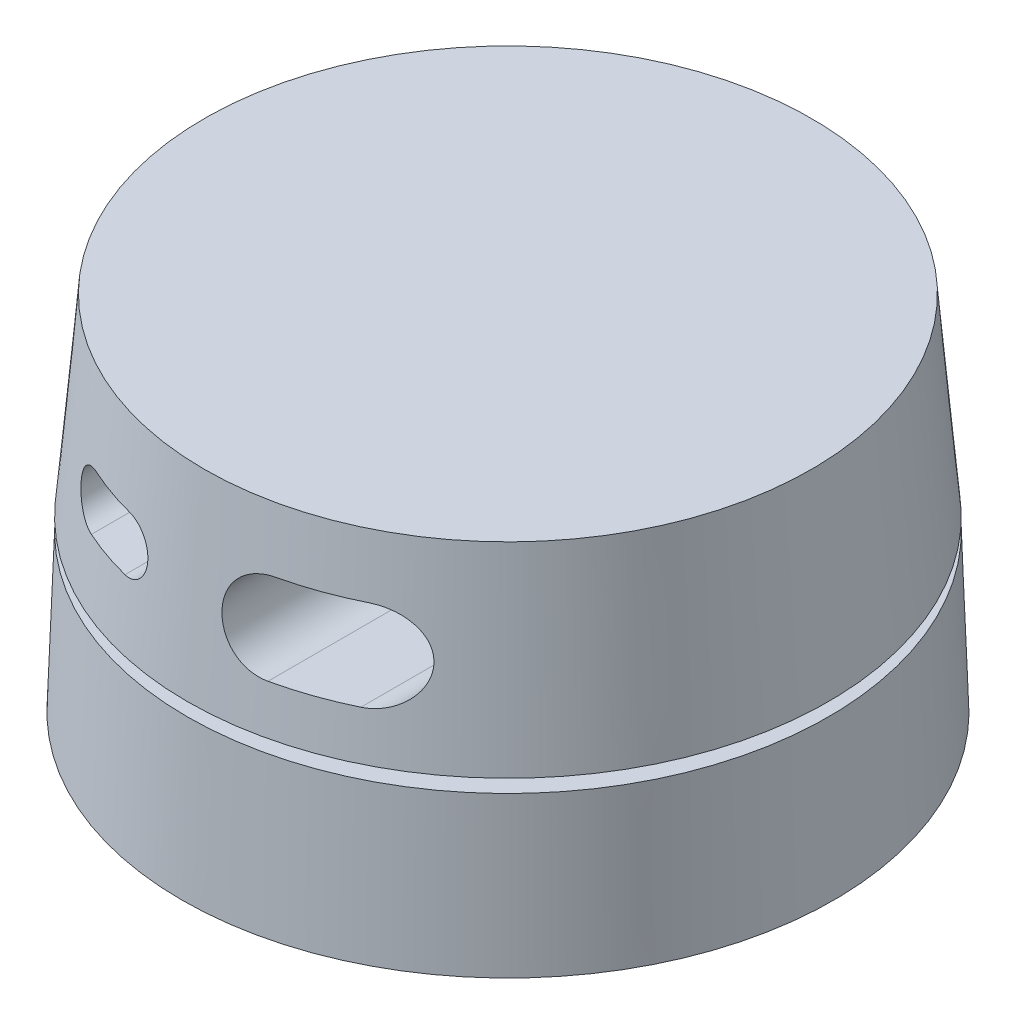
ISO-10303-21;
HEADER;
FILE_DESCRIPTION(('STEP AP214'),'2;1');
FILE_NAME('part.step','',(''),(''),'','','');
FILE_SCHEMA(('AUTOMOTIVE_DESIGN { 1 0 10303 214 1 1 1 1 }'));
ENDSEC;
DATA;
#1=APPLICATION_CONTEXT('core data for automotive mechanical design processes');
#2=APPLICATION_PROTOCOL_DEFINITION('international standard','automotive_design',2000,#1);
#3=PRODUCT_CONTEXT('',#1,'mechanical');
#4=PRODUCT('Part','Part','',(#3));
#5=PRODUCT_RELATED_PRODUCT_CATEGORY('part','',(#4));
#6=PRODUCT_DEFINITION_FORMATION('','',#4);
#7=PRODUCT_DEFINITION_CONTEXT('part definition',#1,'design');
#8=PRODUCT_DEFINITION('design','',#6,#7);
#9=PRODUCT_DEFINITION_SHAPE('','',#8);
#10=(LENGTH_UNIT() NAMED_UNIT(*) SI_UNIT(.MILLI.,.METRE.));
#11=(NAMED_UNIT(*) PLANE_ANGLE_UNIT() SI_UNIT($,.RADIAN.));
#12=(NAMED_UNIT(*) SI_UNIT($,.STERADIAN.) SOLID_ANGLE_UNIT());
#13=UNCERTAINTY_MEASURE_WITH_UNIT(LENGTH_MEASURE(1.E-05),#10,'distance_accuracy_value','');
#14=(GEOMETRIC_REPRESENTATION_CONTEXT(3) GLOBAL_UNCERTAINTY_ASSIGNED_CONTEXT((#13)) GLOBAL_UNIT_ASSIGNED_CONTEXT((#10,
#11,#12)) REPRESENTATION_CONTEXT('',''));
#15=CARTESIAN_POINT('',(0.,0.,0.));
#16=DIRECTION('',(0.,0.,1.));
#17=DIRECTION('',(1.,0.,0.));
#18=AXIS2_PLACEMENT_3D('',#15,#16,#17);
#19=CARTESIAN_POINT('',(0.,0.,0.));
#20=DIRECTION('',(0.,-1.,0.));
#21=DIRECTION('',(0.,0.,1.));
#22=AXIS2_PLACEMENT_3D('',#19,#20,#21);
#23=CONICAL_SURFACE('',#22,37.83,0.0349065850398867);
#24=CARTESIAN_POINT('',(0.,18.1,0.));
#25=DIRECTION('',(0.,1.,0.));
#26=DIRECTION('',(0.,0.,1.));
#27=AXIS2_PLACEMENT_3D('',#24,#25,#26);
#28=CIRCLE('',#27,37.1979340721994);
#29=CARTESIAN_POINT('',(0.,18.1,37.1979340721994));
#30=VERTEX_POINT('',#29);
#31=EDGE_CURVE('E191',#30,#30,#28,.T.);
#32=ORIENTED_EDGE('',*,*,#31,.F.);
#33=EDGE_LOOP('',(#32));
#34=FACE_BOUND('',#33,.T.);
#35=CARTESIAN_POINT('',(0.,0.,0.));
#36=DIRECTION('',(0.,1.,0.));
#37=DIRECTION('',(0.,0.,1.));
#38=AXIS2_PLACEMENT_3D('',#35,#36,#37);
#39=CIRCLE('',#38,37.83);
#40=CARTESIAN_POINT('',(0.,0.,37.83));
#41=VERTEX_POINT('',#40);
#42=EDGE_CURVE('E186',#41,#41,#39,.T.);
#43=ORIENTED_EDGE('',*,*,#42,.T.);
#44=EDGE_LOOP('',(#43));
#45=FACE_BOUND('',#44,.T.);
#46=ADVANCED_FACE('F33',(#34,#45),#23,.T.);
#47=CARTESIAN_POINT('',(0.,18.1,0.));
#48=DIRECTION('',(0.,1.,0.));
#49=DIRECTION('',(0.,0.,1.));
#50=AXIS2_PLACEMENT_3D('',#47,#48,#49);
#51=PLANE('',#50);
#52=CARTESIAN_POINT('',(0.,18.1,0.));
#53=DIRECTION('',(0.,1.,0.));
#54=DIRECTION('',(0.,0.,1.));
#55=AXIS2_PLACEMENT_3D('',#52,#53,#54);
#56=CIRCLE('',#55,34.);
#57=CARTESIAN_POINT('',(0.,18.1,34.));
#58=VERTEX_POINT('',#57);
#59=EDGE_CURVE('E187',#58,#58,#56,.T.);
#60=ORIENTED_EDGE('',*,*,#59,.F.);
#61=EDGE_LOOP('',(#60));
#62=FACE_BOUND('',#61,.T.);
#63=ORIENTED_EDGE('',*,*,#31,.T.);
#64=EDGE_LOOP('',(#63));
#65=FACE_BOUND('',#64,.T.);
#66=ADVANCED_FACE('F261',(#62,#65),#51,.T.);
#67=CARTESIAN_POINT('',(0.,0.,0.));
#68=DIRECTION('',(0.,1.,0.));
#69=DIRECTION('',(0.,0.,1.));
#70=AXIS2_PLACEMENT_3D('',#67,#68,#69);
#71=PLANE('',#70);
#72=CARTESIAN_POINT('',(29.,0.,0.));
#73=DIRECTION('',(0.,-1.,0.));
#74=DIRECTION('',(0.,0.,-1.));
#75=AXIS2_PLACEMENT_3D('',#72,#73,#74);
#76=CIRCLE('',#75,1.5);
#77=CARTESIAN_POINT('',(29.,0.,-1.5));
#78=VERTEX_POINT('',#77);
#79=EDGE_CURVE('E160',#78,#78,#76,.T.);
#80=ORIENTED_EDGE('',*,*,#79,.F.);
#81=EDGE_LOOP('',(#80));
#82=FACE_BOUND('',#81,.T.);
#83=CARTESIAN_POINT('',(-29.,0.,0.));
#84=DIRECTION('',(0.,-1.,0.));
#85=DIRECTION('',(0.,0.,1.));
#86=AXIS2_PLACEMENT_3D('',#83,#84,#85);
#87=CIRCLE('',#86,1.5);
#88=CARTESIAN_POINT('',(-29.,0.,1.5));
#89=VERTEX_POINT('',#88);
#90=EDGE_CURVE('E166',#89,#89,#87,.T.);
#91=ORIENTED_EDGE('',*,*,#90,.F.);
#92=EDGE_LOOP('',(#91));
#93=FACE_BOUND('',#92,.T.);
#94=CARTESIAN_POINT('',(0.,0.,29.));
#95=DIRECTION('',(0.,-1.,0.));
#96=DIRECTION('',(0.,0.,-1.));
#97=AXIS2_PLACEMENT_3D('',#94,#95,#96);
#98=CIRCLE('',#97,1.5);
#99=CARTESIAN_POINT('',(0.,0.,27.5));
#100=VERTEX_POINT('',#99);
#101=EDGE_CURVE('E172',#100,#100,#98,.T.);
#102=ORIENTED_EDGE('',*,*,#101,.F.);
#103=EDGE_LOOP('',(#102));
#104=FACE_BOUND('',#103,.T.);
#105=CARTESIAN_POINT('',(0.,0.,-29.));
#106=DIRECTION('',(0.,-1.,0.));
#107=DIRECTION('',(0.,0.,1.));
#108=AXIS2_PLACEMENT_3D('',#105,#106,#107);
#109=CIRCLE('',#108,1.5);
#110=CARTESIAN_POINT('',(0.,0.,-27.5));
#111=VERTEX_POINT('',#110);
#112=EDGE_CURVE('E133',#111,#111,#109,.T.);
#113=ORIENTED_EDGE('',*,*,#112,.F.);
#114=EDGE_LOOP('',(#113));
#115=FACE_BOUND('',#114,.T.);
#116=ORIENTED_EDGE('',*,*,#42,.F.);
#117=EDGE_LOOP('',(#116));
#118=FACE_BOUND('',#117,.T.);
#119=ADVANCED_FACE('F266',(#82,#93,#104,#115,#118),#71,.F.);
#120=CARTESIAN_POINT('',(0.,19.63,0.));
#121=DIRECTION('',(0.,-1.,0.));
#122=DIRECTION('',(0.,0.,-1.));
#123=AXIS2_PLACEMENT_3D('',#120,#121,#122);
#124=CYLINDRICAL_SURFACE('',#123,34.);
#125=CARTESIAN_POINT('',(0.,19.63,0.));
#126=DIRECTION('',(0.,1.,0.));
#127=DIRECTION('',(0.,0.,1.));
#128=AXIS2_PLACEMENT_3D('',#125,#126,#127);
#129=CIRCLE('',#128,34.);
#130=CARTESIAN_POINT('',(0.,19.63,34.));
#131=VERTEX_POINT('',#130);
#132=EDGE_CURVE('E183',#131,#131,#129,.T.);
#133=ORIENTED_EDGE('',*,*,#132,.F.);
#134=EDGE_LOOP('',(#133));
#135=FACE_BOUND('',#134,.T.);
#136=ORIENTED_EDGE('',*,*,#59,.T.);
#137=EDGE_LOOP('',(#136));
#138=FACE_BOUND('',#137,.T.);
#139=ADVANCED_FACE('F273',(#135,#138),#124,.T.);
#140=CARTESIAN_POINT('',(0.,19.63,0.));
#141=DIRECTION('',(0.,-1.,0.));
#142=DIRECTION('',(0.,0.,1.));
#143=AXIS2_PLACEMENT_3D('',#140,#141,#142);
#144=CONICAL_SURFACE('',#143,37.1979340721994,0.0872664625997167);
#145=CARTESIAN_POINT('',(0.,25.,0.));
#146=DIRECTION('',(0.,-1.,0.));
#147=DIRECTION('',(0.,0.,-1.));
#148=AXIS2_PLACEMENT_3D('',#145,#146,#147);
#149=CIRCLE('',#148,36.7281199490651);
#150=CARTESIAN_POINT('',(16.,25.,33.0598668326555));
#151=VERTEX_POINT('',#150);
#152=CARTESIAN_POINT('',(8.,25.,35.8462661234461));
#153=VERTEX_POINT('',#152);
#154=EDGE_CURVE('E236',#151,#153,#149,.T.);
#155=ORIENTED_EDGE('',*,*,#154,.T.);
#156=CARTESIAN_POINT('',(8.00019999999999,25.000000004,35.8462214874484));
#157=CARTESIAN_POINT('',(7.86384820875268,24.9999793306645,35.876662337591));
#158=CARTESIAN_POINT('',(7.72720326430059,25.005566263638,35.905833745196));
#159=CARTESIAN_POINT('',(7.45427063528124,25.0279892844248,35.9614797109649));
#160=CARTESIAN_POINT('',(7.31798299918749,25.0448268265254,35.9879539199711));
#161=CARTESIAN_POINT('',(7.04674519323057,25.089784883336,36.038039405767));
#162=CARTESIAN_POINT('',(6.91179501463946,25.1179053243667,36.0616507012508));
#163=CARTESIAN_POINT('',(6.64423321596609,25.1853425394309,36.1059063042679));
#164=CARTESIAN_POINT('',(6.51162144378805,25.2246585824008,36.1265508053982));
#165=CARTESIAN_POINT('',(6.24956866730246,25.3143631102717,36.1648407284464));
#166=CARTESIAN_POINT('',(6.12013165501399,25.3647648133315,36.1824825251171));
#167=CARTESIAN_POINT('',(5.8655406115119,25.4763502736118,36.2147360320471));
#168=CARTESIAN_POINT('',(5.74038819170526,25.5375380353362,36.2293466125158));
#169=CARTESIAN_POINT('',(5.49550120791353,25.6702352726594,36.2555581005841));
#170=CARTESIAN_POINT('',(5.37576175158047,25.7417351726328,36.2671617726801));
#171=CARTESIAN_POINT('',(5.14246276106507,25.8946449466837,36.2874655552637));
#172=CARTESIAN_POINT('',(5.02890550785295,25.9760584430763,36.2961646000628));
#173=CARTESIAN_POINT('',(4.81079618521495,26.1467129482063,36.3106504381125));
#174=CARTESIAN_POINT('',(4.70612248528755,26.2357945363603,36.3164849210315));
#175=CARTESIAN_POINT('',(4.50436918423271,26.4223680483399,36.3256121991148));
#176=CARTESIAN_POINT('',(4.40729236678019,26.5198630277675,36.3289040664882));
#177=CARTESIAN_POINT('',(4.22149115969964,26.7225362367138,36.3331122503782));
#178=CARTESIAN_POINT('',(4.13276579939921,26.8277135707985,36.3340288432974));
#179=CARTESIAN_POINT('',(3.96425464790479,27.0450591449865,36.3336724417212));
#180=CARTESIAN_POINT('',(3.88447219516447,27.1572299716553,36.332398632413));
#181=CARTESIAN_POINT('',(3.7344012547424,27.3877981900283,36.32785194823));
#182=CARTESIAN_POINT('',(3.66411786932186,27.5061988809369,36.3245780041875));
#183=CARTESIAN_POINT('',(3.53355137843833,27.748385085544,36.3162230750987));
#184=CARTESIAN_POINT('',(3.47327194683421,27.8721725565153,36.3111414283344));
#185=CARTESIAN_POINT('',(3.36317045588905,28.1241775879342,36.2993626805997));
#186=CARTESIAN_POINT('',(3.31334401942955,28.252393267801,36.2926662583402));
#187=CARTESIAN_POINT('',(3.22442403636639,28.5124611960053,36.2778317726149));
#188=CARTESIAN_POINT('',(3.18533447855042,28.6443147758711,36.2696931752184));
#189=CARTESIAN_POINT('',(3.11775674688995,28.9123345301667,36.2520301579129));
#190=CARTESIAN_POINT('',(3.08940221178114,29.048533547096,36.2424901983142));
#191=CARTESIAN_POINT('',(3.04412828618183,29.3227308704565,36.2222463331676));
#192=CARTESIAN_POINT('',(3.02721289117449,29.4607297884236,36.2115420224469));
#193=CARTESIAN_POINT('',(2.9938541881519,29.8760143796377,36.1778684210785));
#194=CARTESIAN_POINT('',(2.99473236229262,30.1548506649403,36.1533208915411));
#195=CARTESIAN_POINT('',(3.03070979986056,30.5709234453892,36.1137805924761));
#196=CARTESIAN_POINT('',(3.04868582714255,30.7100499781916,36.1000598075717));
#197=CARTESIAN_POINT('',(3.09623143821886,30.9862236803144,36.0717631364811));
#198=CARTESIAN_POINT('',(3.1257971505031,31.1232715281523,36.0571875372249));
#199=CARTESIAN_POINT('',(3.19631201173383,31.3943521422734,36.0271952591113));
#200=CARTESIAN_POINT('',(3.23726530910122,31.528383790505,36.0117782753912));
#201=CARTESIAN_POINT('',(3.33021880102228,31.7924058735871,35.9801037038208));
#202=CARTESIAN_POINT('',(3.38221501781307,31.9223977443269,35.9638464202456));
#203=CARTESIAN_POINT('',(3.49727427434709,32.1783686972977,35.9303402519529));
#204=CARTESIAN_POINT('',(3.56041246061535,32.3043131925064,35.913085205897));
#205=CARTESIAN_POINT('',(3.69699771525738,32.5502849545937,35.8776481021048));
#206=CARTESIAN_POINT('',(3.7704410788309,32.6703143271473,35.859466379006));
#207=CARTESIAN_POINT('',(3.92712429693841,32.9036949402195,35.8221052956451));
#208=CARTESIAN_POINT('',(4.01036749689083,33.0170438802747,35.8029255959529));
#209=CARTESIAN_POINT('',(4.18596876788126,33.2361818720832,35.7635168161593));
#210=CARTESIAN_POINT('',(4.27832354378034,33.3419736331491,35.7432881166679));
#211=CARTESIAN_POINT('',(4.47201455105423,33.5458709400988,35.7015948881663));
#212=CARTESIAN_POINT('',(4.57339782623023,33.6439305226365,35.6801241181246));
#213=CARTESIAN_POINT('',(4.78389592968627,33.8309911329507,35.6359987878365));
#214=CARTESIAN_POINT('',(4.8930079877411,33.919995378839,35.6133446525002));
#215=CARTESIAN_POINT('',(5.11824003290443,34.0884282948086,35.5667856426733));
#216=CARTESIAN_POINT('',(5.23436411759704,34.1678512830683,35.5428800379745));
#217=CARTESIAN_POINT('',(5.47264990358106,34.3165048757829,35.4938117651412));
#218=CARTESIAN_POINT('',(5.59480945321861,34.3857390780333,35.4686495449582));
#219=CARTESIAN_POINT('',(5.84533784510354,34.5141342185847,35.4168422504299));
#220=CARTESIAN_POINT('',(5.97374985584989,34.5732066532143,35.3901865898619));
#221=CARTESIAN_POINT('',(6.23483229200257,34.6801792499484,35.3356214037392));
#222=CARTESIAN_POINT('',(6.36750119799656,34.7280833489923,35.3077123241761));
#223=CARTESIAN_POINT('',(6.63607596594635,34.8124328950277,35.2507109762497));
#224=CARTESIAN_POINT('',(6.77197950217442,34.8488863224637,35.2216195479551));
#225=CARTESIAN_POINT('',(7.04609307737865,34.9101706369093,35.1623401623876));
#226=CARTESIAN_POINT('',(7.18430216749045,34.9350061887904,35.1321526504759));
#227=CARTESIAN_POINT('',(7.43557134982275,34.9693345908615,35.076662335528));
#228=CARTESIAN_POINT('',(7.54839668695903,34.9808510671247,35.051526911948));
#229=CARTESIAN_POINT('',(7.77423029313749,34.996180846213,35.0007581558328));
#230=CARTESIAN_POINT('',(7.88723779927464,35.0000088438636,34.9751258678443));
#231=CARTESIAN_POINT('',(8.00020000000001,34.999999996,34.9492652145835));
#232=B_SPLINE_CURVE_WITH_KNOTS('',3,(#156,#157,#158,#159,#160,#161,#162,#163,#164,#165,#166,
#167,#168,#169,#170,#171,#172,#173,#174,#175,#176,#177,#178,#179,#180,#181,#182,#183,#184,#185,
#186,#187,#188,#189,#190,#191,#192,#193,#194,#195,#196,#197,#198,#199,#200,#201,#202,#203,#204,
#205,#206,#207,#208,#209,#210,#211,#212,#213,#214,#215,#216,#217,#218,#219,#220,#221,#222,#223,
#224,#225,#226,#227,#228,#229,#230,#231),.UNSPECIFIED.,.F.,.F.,(4,2,2,2,2,2,2,2,2,2,2,2,2,2,2,2,
2,2,2,2,2,2,2,2,2,2,2,2,2,2,2,2,2,2,2,2,2,4),(0.,0.419021290324644,0.83809675507294,
1.25716948322311,1.67621485254166,2.0957626122858,2.5154664654487,2.93478307048169,
3.35425335137547,3.76648105088289,4.17885909976634,4.59118915947344,5.00367263598844,
5.41637679780222,5.82923218759345,6.24191435047899,6.65474961949687,7.0725672835842,
7.49053080849578,8.32565291856175,8.74813636137647,9.17047879458089,9.59297528632788,
10.0153198482266,10.4406300788634,10.865787796704,11.291091075908,11.7162411070042,
12.1437529374818,12.5711123029358,12.9987238655742,13.4261840687158,13.8571969918669,
14.28805774856,14.7186175509624,15.1490043239832,15.4972462971356,15.8448220470171),.UNSPECIFIED.);
#233=CARTESIAN_POINT('',(8.,35.,34.9493109954145));
#234=VERTEX_POINT('',#233);
#235=EDGE_CURVE('E11',#153,#234,#232,.T.);
#236=ORIENTED_EDGE('',*,*,#235,.T.);
#237=CARTESIAN_POINT('',(0.,35.,0.));
#238=DIRECTION('',(0.,1.,0.));
#239=DIRECTION('',(0.,0.,1.));
#240=AXIS2_PLACEMENT_3D('',#237,#238,#239);
#241=CIRCLE('',#240,35.8532333138059);
#242=CARTESIAN_POINT('',(16.,35.,32.0851108624265));
#243=VERTEX_POINT('',#242);
#244=EDGE_CURVE('E47',#234,#243,#241,.T.);
#245=ORIENTED_EDGE('',*,*,#244,.T.);
#246=CARTESIAN_POINT('',(15.9998,34.999999996,32.0852105967733));
#247=CARTESIAN_POINT('',(16.1564579360707,35.0000069006381,32.007103475394));
#248=CARTESIAN_POINT('',(16.312806848577,34.9926499063835,31.9284110309251));
#249=CARTESIAN_POINT('',(16.6238532211553,34.9633868512663,31.7704539629361));
#250=CARTESIAN_POINT('',(16.7785506260558,34.9414803058857,31.691189320448));
#251=CARTESIAN_POINT('',(17.0858686710532,34.88317953712,31.5323718887451));
#252=CARTESIAN_POINT('',(17.2384784149174,34.846727221987,31.4528192271536));
#253=CARTESIAN_POINT('',(17.5399079450112,34.7595503731677,31.2944709317042));
#254=CARTESIAN_POINT('',(17.6887277935105,34.7088260741419,31.2156752854215));
#255=CARTESIAN_POINT('',(18.1282936185467,34.535366366369,30.9813732303175));
#256=CARTESIAN_POINT('',(18.4121227221265,34.3913485243811,30.8279637311111));
#257=CARTESIAN_POINT('',(18.9515358028898,34.0485073641843,30.5346319258632));
#258=CARTESIAN_POINT('',(19.2071759685515,33.8497959364932,30.3946828632694));
#259=CARTESIAN_POINT('',(19.6284567567449,33.4494795543776,30.1656694480597));
#260=CARTESIAN_POINT('',(19.801494855002,33.2582457094895,30.0721980264964));
#261=CARTESIAN_POINT('',(20.0396377476261,32.9492856042304,29.9461625201626));
#262=CARTESIAN_POINT('',(20.1154727156002,32.8425723240276,29.906501096005));
#263=CARTESIAN_POINT('',(20.2592586423594,32.6222126397898,29.8325918661652));
#264=CARTESIAN_POINT('',(20.3272130837656,32.5085693324654,29.7983416666705));
#265=CARTESIAN_POINT('',(20.45499412314,32.273986237176,29.7356872597551));
#266=CARTESIAN_POINT('',(20.5147503889434,32.1529947813105,29.7073326784803));
#267=CARTESIAN_POINT('',(20.6246791921786,31.9054318771538,29.6575042089321));
#268=CARTESIAN_POINT('',(20.6748566881065,31.7788633578507,29.6360267567583));
#269=CARTESIAN_POINT('',(20.7649392947812,31.5211747945305,29.6005221112381));
#270=CARTESIAN_POINT('',(20.8048497921817,31.3900571783788,29.5864910069877));
#271=CARTESIAN_POINT('',(20.8738590822998,31.1244198100501,29.5662973957107));
#272=CARTESIAN_POINT('',(20.9029594677106,30.9899005621696,29.5601337292196));
#273=CARTESIAN_POINT('',(20.9469170328459,30.7364395997398,29.556182304418));
#274=CARTESIAN_POINT('',(20.9631340220217,30.6177461498467,29.5574098549374));
#275=CARTESIAN_POINT('',(20.9869985966051,30.3796809759549,29.566015403045));
#276=CARTESIAN_POINT('',(20.9946434971534,30.260309051211,29.5733953263535));
#277=CARTESIAN_POINT('',(21.0013732059807,30.0219143927255,29.594195200307));
#278=CARTESIAN_POINT('',(21.0004621577533,29.9028915178789,29.6076122242948));
#279=CARTESIAN_POINT('',(20.9902394933108,29.6659698466647,29.6402631729738));
#280=CARTESIAN_POINT('',(20.9809246286852,29.5480715027833,29.6594993450867));
#281=CARTESIAN_POINT('',(20.9545903806146,29.3181045710993,29.7027355381957));
#282=CARTESIAN_POINT('',(20.9378353594643,29.2059719854392,29.7265574262618));
#283=CARTESIAN_POINT('',(20.8970206991605,28.9841643962875,29.7789731181685));
#284=CARTESIAN_POINT('',(20.8729585581188,28.8744902483742,29.8075685549143));
#285=CARTESIAN_POINT('',(20.7903412513155,28.5500476284152,29.8999127145759));
#286=CARTESIAN_POINT('',(20.7213377816201,28.3397128167385,29.970247467066));
#287=CARTESIAN_POINT('',(20.5495742943452,27.9118470824897,30.1336448712061));
#288=CARTESIAN_POINT('',(20.4439021854435,27.6961419649335,30.2283696002583));
#289=CARTESIAN_POINT('',(20.2062640356393,27.286425983571,30.430771223998));
#290=CARTESIAN_POINT('',(20.0742842489346,27.0924265440994,30.5384548780387));
#291=CARTESIAN_POINT('',(19.7619005484648,26.6950098217645,30.7830568342028));
#292=CARTESIAN_POINT('',(19.5770565643821,26.496174626832,30.9217497276285));
#293=CARTESIAN_POINT('',(19.1808563611205,26.1328951033996,31.2063789656432));
#294=CARTESIAN_POINT('',(18.9694740053856,25.9684851106763,31.352322364135));
#295=CARTESIAN_POINT('',(18.49021096179,25.6533570823337,31.6696352855318));
#296=CARTESIAN_POINT('',(18.2186456013564,25.5086684675563,31.8414526373526));
#297=CARTESIAN_POINT('',(17.6525059828623,25.2710177780525,32.182471583611));
#298=CARTESIAN_POINT('',(17.3579565311898,25.178000791977,32.3516757683683));
#299=CARTESIAN_POINT('',(16.8836543072758,25.0755632251768,32.6105794111632));
#300=CARTESIAN_POINT('',(16.7092866960382,25.0473880301629,32.7030438502324));
#301=CARTESIAN_POINT('',(16.3569481718516,25.0096172853101,32.8843834260157));
#302=CARTESIAN_POINT('',(16.1789810430029,25.0000031538608,32.9732620651069));
#303=CARTESIAN_POINT('',(15.9998,25.000000004,33.0599636256184));
#304=B_SPLINE_CURVE_WITH_KNOTS('',3,(#246,#247,#248,#249,#250,#251,#252,#253,#254,#255,#256,
#257,#258,#259,#260,#261,#262,#263,#264,#265,#266,#267,#268,#269,#270,#271,#272,#273,#274,#275,
#276,#277,#278,#279,#280,#281,#282,#283,#284,#285,#286,#287,#288,#289,#290,#291,#292,#293,#294,
#295,#296,#297,#298,#299,#300,#301,#302,#303),.UNSPECIFIED.,.F.,.F.,(4,2,2,2,2,2,2,2,2,2,2,2,2,
2,2,2,2,2,2,2,2,2,2,2,2,2,2,2,4),(0.,0.524968418040944,1.04995431905201,1.57705819453287,
2.10415340386048,3.15842218328967,4.21054999925423,5.02985188765592,5.43979312714454,
5.84955250634114,6.26263262998433,6.67549833740214,7.08814698806354,7.50073481755554,
7.85968689497742,8.21875136821499,8.57764196190281,8.93667134059357,9.28385407528525,
9.63115581632419,10.3253144534907,11.0971027618808,11.8692953929249,12.7803768057196,
13.6923626495689,14.7451018521384,15.7967201598987,16.3939841871307,16.9906499784904),.UNSPECIFIED.);
#305=EDGE_CURVE('E238',#243,#151,#304,.T.);
#306=ORIENTED_EDGE('',*,*,#305,.T.);
#307=EDGE_LOOP('',(#155,#236,#245,#306));
#308=FACE_BOUND('',#307,.T.);
#309=CARTESIAN_POINT('',(0.,27.,0.));
#310=DIRECTION('',(0.,-1.,0.));
#311=DIRECTION('',(0.,0.,-1.));
#312=AXIS2_PLACEMENT_3D('',#309,#310,#311);
#313=CIRCLE('',#312,36.5531426220133);
#314=CARTESIAN_POINT('',(-9.,27.,35.4278454826884));
#315=VERTEX_POINT('',#314);
#316=CARTESIAN_POINT('',(-15.,27.,33.3336501983393));
#317=VERTEX_POINT('',#316);
#318=EDGE_CURVE('E190',#315,#317,#313,.T.);
#319=ORIENTED_EDGE('',*,*,#318,.T.);
#320=CARTESIAN_POINT('',(-14.9998,27.0000000066667,33.3337401961227));
#321=CARTESIAN_POINT('',(-15.0940275492495,26.9999990326375,33.2913417133965));
#322=CARTESIAN_POINT('',(-15.1878576518243,27.0044280408543,33.2482106087507));
#323=CARTESIAN_POINT('',(-15.3741343595695,27.0219495259807,33.1607960959285));
#324=CARTESIAN_POINT('',(-15.4665813221254,27.0350397239884,33.1165129938051));
#325=CARTESIAN_POINT('',(-15.7408200415348,27.0869695657723,32.9824778745224));
#326=CARTESIAN_POINT('',(-15.9197380916999,27.1384694149368,32.8914370120563));
#327=CARTESIAN_POINT('',(-16.2647007923486,27.2733084413059,32.709056088627));
#328=CARTESIAN_POINT('',(-16.4307527554135,27.3566293705904,32.6177162288323));
#329=CARTESIAN_POINT('',(-16.7458171875634,27.5532425935554,32.4377328586884));
#330=CARTESIAN_POINT('',(-16.894824701498,27.6665435714564,32.3490901379191));
#331=CARTESIAN_POINT('',(-17.1717786748197,27.9217972122653,32.1776238930314));
#332=CARTESIAN_POINT('',(-17.2996293552138,28.063874027876,32.0948277560423));
#333=CARTESIAN_POINT('',(-17.4708712698389,28.2958666395411,31.9785894774062));
#334=CARTESIAN_POINT('',(-17.5245500498741,28.3763862344014,31.9411535747533));
#335=CARTESIAN_POINT('',(-17.6243850062679,28.5432781006051,31.8694911250199));
#336=CARTESIAN_POINT('',(-17.6705460020935,28.6296465716897,31.8352625278395));
#337=CARTESIAN_POINT('',(-17.750789148689,28.7995159578145,31.7735602744474));
#338=CARTESIAN_POINT('',(-17.7855895400426,28.8825579407576,31.7457551799802));
#339=CARTESIAN_POINT('',(-17.8478425486808,29.0523892980647,31.6937463833744));
#340=CARTESIAN_POINT('',(-17.8752996540722,29.1391763456548,31.6695404854966));
#341=CARTESIAN_POINT('',(-17.9223617888587,29.315792324585,31.6251716721432));
#342=CARTESIAN_POINT('',(-17.9419734454864,29.405618618731,31.6050053515639));
#343=CARTESIAN_POINT('',(-17.9729411482721,29.5875123017503,31.569094088853));
#344=CARTESIAN_POINT('',(-17.9842986651457,29.6795792883561,31.5533483593712));
#345=CARTESIAN_POINT('',(-18.0034341675697,29.9313310517535,31.5170783021574));
#346=CARTESIAN_POINT('',(-18.0028886879106,30.0924315206062,31.5011491954714));
#347=CARTESIAN_POINT('',(-17.9757768126504,30.4130967352523,31.4843266815135));
#348=CARTESIAN_POINT('',(-17.9492248683283,30.5726622842446,31.4834249288506));
#349=CARTESIAN_POINT('',(-17.8744232196707,30.8713983771539,31.4958999070598));
#350=CARTESIAN_POINT('',(-17.8282359387528,31.0111427345395,31.5080553373432));
#351=CARTESIAN_POINT('',(-17.7166299024482,31.2811187697354,31.5438569474797));
#352=CARTESIAN_POINT('',(-17.6512102616693,31.4113500092494,31.5675036563849));
#353=CARTESIAN_POINT('',(-17.5017806970682,31.6621976987186,31.6255184376217));
#354=CARTESIAN_POINT('',(-17.4173792055538,31.7825255186321,31.6601197255983));
#355=CARTESIAN_POINT('',(-17.2336670327055,32.007958474305,31.7380531064625));
#356=CARTESIAN_POINT('',(-17.1343523101836,32.1130594686842,31.7813875669577));
#357=CARTESIAN_POINT('',(-16.9130808315402,32.3162165230545,31.8796147627531));
#358=CARTESIAN_POINT('',(-16.7898553466946,32.4125398496036,31.9352275992076));
#359=CARTESIAN_POINT('',(-16.5320253494678,32.583969800428,32.0525842854192));
#360=CARTESIAN_POINT('',(-16.3974115381238,32.6590588646683,32.1143331527819));
#361=CARTESIAN_POINT('',(-16.1035542613608,32.7948844340972,32.2494958600661));
#362=CARTESIAN_POINT('',(-15.9432803900416,32.8528749450968,32.3234257518112));
#363=CARTESIAN_POINT('',(-15.616602611079,32.9408082639563,32.4739758201845));
#364=CARTESIAN_POINT('',(-15.4502060849666,32.9707837652908,32.5505927523831));
#365=CARTESIAN_POINT('',(-15.2357384916685,32.9910987512964,32.6490898445429));
#366=CARTESIAN_POINT('',(-15.1885705003304,32.9944415521034,32.670736768853));
#367=CARTESIAN_POINT('',(-15.094208711459,32.9988910714988,32.7140106529081));
#368=CARTESIAN_POINT('',(-15.0470150675362,33.0000012517323,32.735637591512));
#369=CARTESIAN_POINT('',(-14.9998,32.9999999933333,32.7572581573007));
#370=B_SPLINE_CURVE_WITH_KNOTS('',3,(#320,#321,#322,#323,#324,#325,#326,#327,#328,#329,#330,
#331,#332,#333,#334,#335,#336,#337,#338,#339,#340,#341,#342,#343,#344,#345,#346,#347,#348,#349,
#350,#351,#352,#353,#354,#355,#356,#357,#358,#359,#360,#361,#362,#363,#364,#365,#366,#367,#368,
#369),.UNSPECIFIED.,.F.,.F.,(4,2,2,2,2,2,2,2,2,2,2,2,2,2,2,2,2,2,2,2,2,2,2,2,4),(0.,
0.309767178515322,0.619452884570143,1.23808210551195,1.8563571025517,2.47481138967298,
3.09599311076129,3.40687775252196,3.71756230249198,3.99986211887491,4.28198900146809,
4.56387705913042,4.84571487789399,5.32846671450323,5.81095044755076,6.2519398837688,
6.692949624817,7.14406292703924,7.59529869329997,8.09129081824882,8.58769192080424,
9.1427743499221,9.6972081868335,9.85319411212588,10.0089379965065),.UNSPECIFIED.);
#371=CARTESIAN_POINT('',(-15.,33.,32.7571665743852));
#372=VERTEX_POINT('',#371);
#373=EDGE_CURVE('E229',#317,#372,#370,.T.);
#374=ORIENTED_EDGE('',*,*,#373,.T.);
#375=CARTESIAN_POINT('',(0.,33.,0.));
#376=DIRECTION('',(0.,1.,0.));
#377=DIRECTION('',(0.,0.,1.));
#378=AXIS2_PLACEMENT_3D('',#375,#376,#377);
#379=CIRCLE('',#378,36.0282106408578);
#380=CARTESIAN_POINT('',(-9.,33.,34.8859851800406));
#381=VERTEX_POINT('',#380);
#382=EDGE_CURVE('E208',#372,#381,#379,.T.);
#383=ORIENTED_EDGE('',*,*,#382,.T.);
#384=CARTESIAN_POINT('',(-9.0002,32.9999999933333,34.8859335833806));
#385=CARTESIAN_POINT('',(-8.91363575885012,33.0000126016071,34.9082684226609));
#386=CARTESIAN_POINT('',(-8.82707173657598,32.9962647806501,34.9305927470007));
#387=CARTESIAN_POINT('',(-8.65455024423421,32.9813002946264,34.9750837722569));
#388=CARTESIAN_POINT('',(-8.56859277840541,32.9700835774164,34.9972504720716));
#389=CARTESIAN_POINT('',(-8.39789645399481,32.9402341390135,35.041288122654));
#390=CARTESIAN_POINT('',(-8.31315752835676,32.9216018275313,35.0631590896917));
#391=CARTESIAN_POINT('',(-8.14553539062924,32.877050816102,35.1064797965576));
#392=CARTESIAN_POINT('',(-8.06265213402289,32.8511322911514,35.1279295464891));
#393=CARTESIAN_POINT('',(-7.81756791016148,32.7626021919974,35.1915180858305));
#394=CARTESIAN_POINT('',(-7.65890870278965,32.6892119275384,35.2329022759032));
#395=CARTESIAN_POINT('',(-7.35633670266539,32.5157126624692,35.3128246932045));
#396=CARTESIAN_POINT('',(-7.21241800172601,32.4156144252169,35.3513640589321));
#397=CARTESIAN_POINT('',(-6.94517501554696,32.1926295740805,35.4247112049341));
#398=CARTESIAN_POINT('',(-6.82163953424504,32.0700087191351,35.4595557119582));
#399=CARTESIAN_POINT('',(-6.59721305036199,31.8046639585055,35.5256079114901));
#400=CARTESIAN_POINT('',(-6.49632428870281,31.6619380656742,35.5568152439481));
#401=CARTESIAN_POINT('',(-6.32218008113622,31.3633079078882,35.6147236027755));
#402=CARTESIAN_POINT('',(-6.24845135799388,31.207693661621,35.6414968365659));
#403=CARTESIAN_POINT('',(-6.12854253692683,30.885581844557,35.69090543135));
#404=CARTESIAN_POINT('',(-6.08235812833185,30.719085981255,35.7135414394324));
#405=CARTESIAN_POINT('',(-6.01973500098379,30.3830498140249,35.7539634555855));
#406=CARTESIAN_POINT('',(-6.0027947122316,30.2136122573944,35.7718267083554));
#407=CARTESIAN_POINT('',(-5.99784313715404,29.8738736654691,35.8027952753665));
#408=CARTESIAN_POINT('',(-6.00982997921178,29.7035726867502,35.8159008973686));
#409=CARTESIAN_POINT('',(-6.0621553555933,29.3697940793392,35.8366978765584));
#410=CARTESIAN_POINT('',(-6.10204605608693,29.2062513140041,35.8444709650904));
#411=CARTESIAN_POINT('',(-6.2086615907143,28.8879804626567,35.854417093937));
#412=CARTESIAN_POINT('',(-6.27538400682814,28.7332515837888,35.8565906387404));
#413=CARTESIAN_POINT('',(-6.43270099914619,28.4390920661895,35.8548457788851));
#414=CARTESIAN_POINT('',(-6.52297204570059,28.2994878571194,35.8510066536101));
#415=CARTESIAN_POINT('',(-6.72510630816951,28.0372839667739,35.8369791444517));
#416=CARTESIAN_POINT('',(-6.83696708813129,27.9146823697866,35.8267914765807));
#417=CARTESIAN_POINT('',(-7.07817076191788,27.6905591456123,35.799903604537));
#418=CARTESIAN_POINT('',(-7.20740481238757,27.5889155317637,35.7832428154396));
#419=CARTESIAN_POINT('',(-7.48003807719586,27.4083886559633,35.7433824291197));
#420=CARTESIAN_POINT('',(-7.62344160339688,27.32951235106,35.720180837484));
#421=CARTESIAN_POINT('',(-7.92158471872541,27.1957175913648,35.6672445356148));
#422=CARTESIAN_POINT('',(-8.07642169460693,27.1410416956928,35.637447982173));
#423=CARTESIAN_POINT('',(-8.39164623419362,27.0578218419327,35.5720186137859));
#424=CARTESIAN_POINT('',(-8.55202664079583,27.0292454053418,35.5363931177629));
#425=CARTESIAN_POINT('',(-8.76075873303825,27.0091653051188,35.4869719323944));
#426=CARTESIAN_POINT('',(-8.8086983959695,27.0057196788895,35.4754131079165));
#427=CARTESIAN_POINT('',(-8.90450258070252,27.0011387115726,35.4518998372178));
#428=CARTESIAN_POINT('',(-8.95236708800548,26.9999993584592,35.43994611486));
#429=CARTESIAN_POINT('',(-9.0002,27.0000000066667,35.427794673993));
#430=B_SPLINE_CURVE_WITH_KNOTS('',3,(#384,#385,#386,#387,#388,#389,#390,#391,#392,#393,#394,
#395,#396,#397,#398,#399,#400,#401,#402,#403,#404,#405,#406,#407,#408,#409,#410,#411,#412,#413,
#414,#415,#416,#417,#418,#419,#420,#421,#422,#423,#424,#425,#426,#427,#428,#429),.UNSPECIFIED.,
.F.,.F.,(4,2,2,2,2,2,2,2,2,2,2,2,2,2,2,2,2,2,2,2,2,2,4),(0.,0.268112957777016,0.536227787374477,
0.804327805713025,1.07242138551426,1.60853476067154,2.14443240671386,2.67437141502241,
3.20436283838248,3.72462498998298,4.24480569945945,4.75597264373196,5.26710651583269,
5.77021989852775,6.27328795181993,6.7697784966697,7.26621305559306,7.75967101980593,
8.25327961163729,8.75172937860479,9.24955801975956,9.39782263169717,9.54582909796503),.UNSPECIFIED.);
#431=EDGE_CURVE('E200',#381,#315,#430,.T.);
#432=ORIENTED_EDGE('',*,*,#431,.T.);
#433=EDGE_LOOP('',(#319,#374,#383,#432));
#434=FACE_BOUND('',#433,.T.);
#435=CARTESIAN_POINT('',(0.,42.,0.));
#436=DIRECTION('',(0.,1.,0.));
#437=DIRECTION('',(0.,0.,1.));
#438=AXIS2_PLACEMENT_3D('',#435,#436,#437);
#439=CIRCLE('',#438,35.2408126691244);
#440=CARTESIAN_POINT('',(0.,42.,35.2408126691244));
#441=VERTEX_POINT('',#440);
#442=EDGE_CURVE('E182',#441,#441,#439,.T.);
#443=ORIENTED_EDGE('',*,*,#442,.F.);
#444=EDGE_LOOP('',(#443));
#445=FACE_BOUND('',#444,.T.);
#446=CARTESIAN_POINT('',(0.,19.63,0.));
#447=DIRECTION('',(0.,1.,0.));
#448=DIRECTION('',(0.,0.,1.));
#449=AXIS2_PLACEMENT_3D('',#446,#447,#448);
#450=CIRCLE('',#449,37.1979340721994);
#451=CARTESIAN_POINT('',(0.,19.63,37.1979340721994));
#452=VERTEX_POINT('',#451);
#453=EDGE_CURVE('E159',#452,#452,#450,.T.);
#454=ORIENTED_EDGE('',*,*,#453,.T.);
#455=EDGE_LOOP('',(#454));
#456=FACE_BOUND('',#455,.T.);
#457=ADVANCED_FACE('F35',(#308,#434,#445,#456),#144,.T.);
#458=CARTESIAN_POINT('',(0.,42.,0.));
#459=DIRECTION('',(0.,1.,0.));
#460=DIRECTION('',(0.,0.,1.));
#461=AXIS2_PLACEMENT_3D('',#458,#459,#460);
#462=PLANE('',#461);
#463=ORIENTED_EDGE('',*,*,#442,.T.);
#464=EDGE_LOOP('',(#463));
#465=FACE_BOUND('',#464,.T.);
#466=ADVANCED_FACE('F283',(#465),#462,.T.);
#467=CARTESIAN_POINT('',(0.,19.63,0.));
#468=DIRECTION('',(0.,1.,0.));
#469=DIRECTION('',(0.,0.,1.));
#470=AXIS2_PLACEMENT_3D('',#467,#468,#469);
#471=PLANE('',#470);
#472=ORIENTED_EDGE('',*,*,#132,.T.);
#473=EDGE_LOOP('',(#472));
#474=FACE_BOUND('',#473,.T.);
#475=ORIENTED_EDGE('',*,*,#453,.F.);
#476=EDGE_LOOP('',(#475));
#477=FACE_BOUND('',#476,.T.);
#478=ADVANCED_FACE('F279',(#474,#477),#471,.F.);
#479=CARTESIAN_POINT('',(0.,10.,-29.));
#480=DIRECTION('',(0.,-1.,0.));
#481=DIRECTION('',(0.,0.,-1.));
#482=AXIS2_PLACEMENT_3D('',#479,#480,#481);
#483=CYLINDRICAL_SURFACE('',#482,1.5);
#484=CARTESIAN_POINT('',(0.,10.,-29.));
#485=DIRECTION('',(0.,-1.,0.));
#486=DIRECTION('',(0.,0.,1.));
#487=AXIS2_PLACEMENT_3D('',#484,#485,#486);
#488=CIRCLE('',#487,1.5);
#489=CARTESIAN_POINT('',(0.,10.,-27.5));
#490=VERTEX_POINT('',#489);
#491=EDGE_CURVE('E175',#490,#490,#488,.T.);
#492=ORIENTED_EDGE('',*,*,#491,.F.);
#493=EDGE_LOOP('',(#492));
#494=FACE_BOUND('',#493,.T.);
#495=ORIENTED_EDGE('',*,*,#112,.T.);
#496=EDGE_LOOP('',(#495));
#497=FACE_BOUND('',#496,.T.);
#498=ADVANCED_FACE('F282',(#494,#497),#483,.F.);
#499=CARTESIAN_POINT('',(0.,10.,-29.));
#500=DIRECTION('',(0.,1.,0.));
#501=DIRECTION('',(0.,0.,1.));
#502=AXIS2_PLACEMENT_3D('',#499,#500,#501);
#503=PLANE('',#502);
#504=ORIENTED_EDGE('',*,*,#491,.T.);
#505=EDGE_LOOP('',(#504));
#506=FACE_BOUND('',#505,.T.);
#507=ADVANCED_FACE('F290',(#506),#503,.F.);
#508=CARTESIAN_POINT('',(0.,10.,29.));
#509=DIRECTION('',(0.,-1.,0.));
#510=DIRECTION('',(0.,0.,-1.));
#511=AXIS2_PLACEMENT_3D('',#508,#509,#510);
#512=CYLINDRICAL_SURFACE('',#511,1.5);
#513=CARTESIAN_POINT('',(0.,10.,29.));
#514=DIRECTION('',(0.,-1.,0.));
#515=DIRECTION('',(0.,0.,-1.));
#516=AXIS2_PLACEMENT_3D('',#513,#514,#515);
#517=CIRCLE('',#516,1.5);
#518=CARTESIAN_POINT('',(0.,10.,27.5));
#519=VERTEX_POINT('',#518);
#520=EDGE_CURVE('E169',#519,#519,#517,.T.);
#521=ORIENTED_EDGE('',*,*,#520,.F.);
#522=EDGE_LOOP('',(#521));
#523=FACE_BOUND('',#522,.T.);
#524=ORIENTED_EDGE('',*,*,#101,.T.);
#525=EDGE_LOOP('',(#524));
#526=FACE_BOUND('',#525,.T.);
#527=ADVANCED_FACE('F294',(#523,#526),#512,.F.);
#528=CARTESIAN_POINT('',(0.,10.,29.));
#529=DIRECTION('',(0.,-1.,0.));
#530=DIRECTION('',(0.,0.,-1.));
#531=AXIS2_PLACEMENT_3D('',#528,#529,#530);
#532=PLANE('',#531);
#533=ORIENTED_EDGE('',*,*,#520,.T.);
#534=EDGE_LOOP('',(#533));
#535=FACE_BOUND('',#534,.T.);
#536=ADVANCED_FACE('F298',(#535),#532,.T.);
#537=CARTESIAN_POINT('',(-29.,10.,0.));
#538=DIRECTION('',(0.,-1.,0.));
#539=DIRECTION('',(0.,0.,-1.));
#540=AXIS2_PLACEMENT_3D('',#537,#538,#539);
#541=CYLINDRICAL_SURFACE('',#540,1.5);
#542=CARTESIAN_POINT('',(-29.,10.,0.));
#543=DIRECTION('',(0.,-1.,0.));
#544=DIRECTION('',(0.,0.,1.));
#545=AXIS2_PLACEMENT_3D('',#542,#543,#544);
#546=CIRCLE('',#545,1.5);
#547=CARTESIAN_POINT('',(-29.,10.,1.5));
#548=VERTEX_POINT('',#547);
#549=EDGE_CURVE('E163',#548,#548,#546,.T.);
#550=ORIENTED_EDGE('',*,*,#549,.F.);
#551=EDGE_LOOP('',(#550));
#552=FACE_BOUND('',#551,.T.);
#553=ORIENTED_EDGE('',*,*,#90,.T.);
#554=EDGE_LOOP('',(#553));
#555=FACE_BOUND('',#554,.T.);
#556=ADVANCED_FACE('F302',(#552,#555),#541,.F.);
#557=CARTESIAN_POINT('',(-29.,10.,0.));
#558=DIRECTION('',(0.,1.,0.));
#559=DIRECTION('',(0.,0.,1.));
#560=AXIS2_PLACEMENT_3D('',#557,#558,#559);
#561=PLANE('',#560);
#562=ORIENTED_EDGE('',*,*,#549,.T.);
#563=EDGE_LOOP('',(#562));
#564=FACE_BOUND('',#563,.T.);
#565=ADVANCED_FACE('F306',(#564),#561,.F.);
#566=CARTESIAN_POINT('',(29.,10.,0.));
#567=DIRECTION('',(0.,-1.,0.));
#568=DIRECTION('',(0.,0.,-1.));
#569=AXIS2_PLACEMENT_3D('',#566,#567,#568);
#570=CYLINDRICAL_SURFACE('',#569,1.5);
#571=CARTESIAN_POINT('',(29.,10.,0.));
#572=DIRECTION('',(0.,-1.,0.));
#573=DIRECTION('',(0.,0.,-1.));
#574=AXIS2_PLACEMENT_3D('',#571,#572,#573);
#575=CIRCLE('',#574,1.5);
#576=CARTESIAN_POINT('',(29.,10.,-1.5));
#577=VERTEX_POINT('',#576);
#578=EDGE_CURVE('E156',#577,#577,#575,.T.);
#579=ORIENTED_EDGE('',*,*,#578,.F.);
#580=EDGE_LOOP('',(#579));
#581=FACE_BOUND('',#580,.T.);
#582=ORIENTED_EDGE('',*,*,#79,.T.);
#583=EDGE_LOOP('',(#582));
#584=FACE_BOUND('',#583,.T.);
#585=ADVANCED_FACE('F309',(#581,#584),#570,.F.);
#586=CARTESIAN_POINT('',(29.,10.,0.));
#587=DIRECTION('',(0.,-1.,0.));
#588=DIRECTION('',(0.,0.,-1.));
#589=AXIS2_PLACEMENT_3D('',#586,#587,#588);
#590=PLANE('',#589);
#591=ORIENTED_EDGE('',*,*,#578,.T.);
#592=EDGE_LOOP('',(#591));
#593=FACE_BOUND('',#592,.T.);
#594=ADVANCED_FACE('F226',(#593),#590,.T.);
#595=CARTESIAN_POINT('',(-15.,30.,10.));
#596=DIRECTION('',(0.,0.,1.));
#597=DIRECTION('',(1.,0.,0.));
#598=AXIS2_PLACEMENT_3D('',#595,#596,#597);
#599=CYLINDRICAL_SURFACE('',#598,3.);
#600=DIRECTION('',(0.,0.,1.));
#601=VECTOR('',#600,1.);
#602=CARTESIAN_POINT('',(-15.,27.,10.));
#603=LINE('',#602,#601);
#604=CARTESIAN_POINT('',(-15.,27.,10.));
#605=VERTEX_POINT('',#604);
#606=EDGE_CURVE('E62',#605,#317,#603,.T.);
#607=ORIENTED_EDGE('',*,*,#606,.F.);
#608=CARTESIAN_POINT('',(-15.,30.,10.));
#609=DIRECTION('',(0.,0.,1.));
#610=DIRECTION('',(1.,0.,0.));
#611=AXIS2_PLACEMENT_3D('',#608,#609,#610);
#612=CIRCLE('',#611,3.);
#613=CARTESIAN_POINT('',(-15.,33.,10.));
#614=VERTEX_POINT('',#613);
#615=EDGE_CURVE('E138',#614,#605,#612,.T.);
#616=ORIENTED_EDGE('',*,*,#615,.F.);
#617=DIRECTION('',(0.,0.,1.));
#618=VECTOR('',#617,1.);
#619=CARTESIAN_POINT('',(-15.,33.,10.));
#620=LINE('',#619,#618);
#621=EDGE_CURVE('E123',#614,#372,#620,.T.);
#622=ORIENTED_EDGE('',*,*,#621,.T.);
#623=ORIENTED_EDGE('',*,*,#373,.F.);
#624=EDGE_LOOP('',(#607,#616,#622,#623));
#625=FACE_BOUND('',#624,.T.);
#626=ADVANCED_FACE('F222',(#625),#599,.F.);
#627=CARTESIAN_POINT('',(-15.,33.,10.));
#628=DIRECTION('',(0.,1.,0.));
#629=DIRECTION('',(0.,0.,1.));
#630=AXIS2_PLACEMENT_3D('',#627,#628,#629);
#631=PLANE('',#630);
#632=ORIENTED_EDGE('',*,*,#621,.F.);
#633=DIRECTION('',(-1.,0.,0.));
#634=VECTOR('',#633,1.);
#635=CARTESIAN_POINT('',(-15.,33.,10.));
#636=LINE('',#635,#634);
#637=CARTESIAN_POINT('',(-9.,33.,10.));
#638=VERTEX_POINT('',#637);
#639=EDGE_CURVE('E147',#638,#614,#636,.T.);
#640=ORIENTED_EDGE('',*,*,#639,.F.);
#641=DIRECTION('',(0.,0.,1.));
#642=VECTOR('',#641,1.);
#643=CARTESIAN_POINT('',(-9.,33.,10.));
#644=LINE('',#643,#642);
#645=EDGE_CURVE('E126',#638,#381,#644,.T.);
#646=ORIENTED_EDGE('',*,*,#645,.T.);
#647=ORIENTED_EDGE('',*,*,#382,.F.);
#648=EDGE_LOOP('',(#632,#640,#646,#647));
#649=FACE_BOUND('',#648,.T.);
#650=ADVANCED_FACE('F216',(#649),#631,.F.);
#651=CARTESIAN_POINT('',(-9.,30.,10.));
#652=DIRECTION('',(0.,0.,1.));
#653=DIRECTION('',(1.,0.,0.));
#654=AXIS2_PLACEMENT_3D('',#651,#652,#653);
#655=CYLINDRICAL_SURFACE('',#654,3.);
#656=ORIENTED_EDGE('',*,*,#645,.F.);
#657=CARTESIAN_POINT('',(-9.,30.,10.));
#658=DIRECTION('',(0.,0.,1.));
#659=DIRECTION('',(1.,0.,0.));
#660=AXIS2_PLACEMENT_3D('',#657,#658,#659);
#661=CIRCLE('',#660,3.);
#662=CARTESIAN_POINT('',(-9.,27.,10.));
#663=VERTEX_POINT('',#662);
#664=EDGE_CURVE('E144',#663,#638,#661,.T.);
#665=ORIENTED_EDGE('',*,*,#664,.F.);
#666=DIRECTION('',(0.,0.,1.));
#667=VECTOR('',#666,1.);
#668=CARTESIAN_POINT('',(-9.,27.,10.));
#669=LINE('',#668,#667);
#670=EDGE_CURVE('E152',#663,#315,#669,.T.);
#671=ORIENTED_EDGE('',*,*,#670,.T.);
#672=ORIENTED_EDGE('',*,*,#431,.F.);
#673=EDGE_LOOP('',(#656,#665,#671,#672));
#674=FACE_BOUND('',#673,.T.);
#675=ADVANCED_FACE('F210',(#674),#655,.F.);
#676=CARTESIAN_POINT('',(-15.,27.,10.));
#677=DIRECTION('',(0.,-1.,0.));
#678=DIRECTION('',(0.,0.,-1.));
#679=AXIS2_PLACEMENT_3D('',#676,#677,#678);
#680=PLANE('',#679);
#681=ORIENTED_EDGE('',*,*,#670,.F.);
#682=DIRECTION('',(1.,0.,0.));
#683=VECTOR('',#682,1.);
#684=CARTESIAN_POINT('',(-15.,27.,10.));
#685=LINE('',#684,#683);
#686=EDGE_CURVE('E141',#605,#663,#685,.T.);
#687=ORIENTED_EDGE('',*,*,#686,.F.);
#688=ORIENTED_EDGE('',*,*,#606,.T.);
#689=ORIENTED_EDGE('',*,*,#318,.F.);
#690=EDGE_LOOP('',(#681,#687,#688,#689));
#691=FACE_BOUND('',#690,.T.);
#692=ADVANCED_FACE('F215',(#691),#680,.F.);
#693=CARTESIAN_POINT('',(-15.,30.,10.));
#694=DIRECTION('',(0.,0.,1.));
#695=DIRECTION('',(1.,0.,0.));
#696=AXIS2_PLACEMENT_3D('',#693,#694,#695);
#697=PLANE('',#696);
#698=ORIENTED_EDGE('',*,*,#615,.T.);
#699=ORIENTED_EDGE('',*,*,#686,.T.);
#700=ORIENTED_EDGE('',*,*,#664,.T.);
#701=ORIENTED_EDGE('',*,*,#639,.T.);
#702=EDGE_LOOP('',(#698,#699,#700,#701));
#703=FACE_BOUND('',#702,.T.);
#704=ADVANCED_FACE('F221',(#703),#697,.T.);
#705=CARTESIAN_POINT('',(8.,30.,10.));
#706=DIRECTION('',(0.,0.,1.));
#707=DIRECTION('',(1.,0.,0.));
#708=AXIS2_PLACEMENT_3D('',#705,#706,#707);
#709=CYLINDRICAL_SURFACE('',#708,5.);
#710=DIRECTION('',(0.,0.,1.));
#711=VECTOR('',#710,1.);
#712=CARTESIAN_POINT('',(8.,25.,10.));
#713=LINE('',#712,#711);
#714=CARTESIAN_POINT('',(8.,25.,10.));
#715=VERTEX_POINT('',#714);
#716=EDGE_CURVE('E54',#715,#153,#713,.T.);
#717=ORIENTED_EDGE('',*,*,#716,.F.);
#718=CARTESIAN_POINT('',(8.,30.,10.));
#719=DIRECTION('',(0.,0.,1.));
#720=DIRECTION('',(1.,0.,0.));
#721=AXIS2_PLACEMENT_3D('',#718,#719,#720);
#722=CIRCLE('',#721,5.);
#723=CARTESIAN_POINT('',(8.,35.,10.));
#724=VERTEX_POINT('',#723);
#725=EDGE_CURVE('E106',#724,#715,#722,.T.);
#726=ORIENTED_EDGE('',*,*,#725,.F.);
#727=DIRECTION('',(0.,0.,1.));
#728=VECTOR('',#727,1.);
#729=CARTESIAN_POINT('',(8.,35.,10.));
#730=LINE('',#729,#728);
#731=EDGE_CURVE('E131',#724,#234,#730,.T.);
#732=ORIENTED_EDGE('',*,*,#731,.T.);
#733=ORIENTED_EDGE('',*,*,#235,.F.);
#734=EDGE_LOOP('',(#717,#726,#732,#733));
#735=FACE_BOUND('',#734,.T.);
#736=ADVANCED_FACE('F103',(#735),#709,.F.);
#737=CARTESIAN_POINT('',(8.,35.,10.));
#738=DIRECTION('',(0.,1.,0.));
#739=DIRECTION('',(0.,0.,1.));
#740=AXIS2_PLACEMENT_3D('',#737,#738,#739);
#741=PLANE('',#740);
#742=ORIENTED_EDGE('',*,*,#731,.F.);
#743=DIRECTION('',(-1.,0.,0.));
#744=VECTOR('',#743,1.);
#745=CARTESIAN_POINT('',(8.,35.,10.));
#746=LINE('',#745,#744);
#747=CARTESIAN_POINT('',(16.,35.,10.));
#748=VERTEX_POINT('',#747);
#749=EDGE_CURVE('E110',#748,#724,#746,.T.);
#750=ORIENTED_EDGE('',*,*,#749,.F.);
#751=DIRECTION('',(0.,0.,1.));
#752=VECTOR('',#751,1.);
#753=CARTESIAN_POINT('',(16.,35.,10.));
#754=LINE('',#753,#752);
#755=EDGE_CURVE('E134',#748,#243,#754,.T.);
#756=ORIENTED_EDGE('',*,*,#755,.T.);
#757=ORIENTED_EDGE('',*,*,#244,.F.);
#758=EDGE_LOOP('',(#742,#750,#756,#757));
#759=FACE_BOUND('',#758,.T.);
#760=ADVANCED_FACE('F250',(#759),#741,.F.);
#761=CARTESIAN_POINT('',(16.,30.,10.));
#762=DIRECTION('',(0.,0.,1.));
#763=DIRECTION('',(1.,0.,0.));
#764=AXIS2_PLACEMENT_3D('',#761,#762,#763);
#765=CYLINDRICAL_SURFACE('',#764,5.);
#766=ORIENTED_EDGE('',*,*,#755,.F.);
#767=CARTESIAN_POINT('',(16.,30.,10.));
#768=DIRECTION('',(0.,0.,1.));
#769=DIRECTION('',(1.,0.,0.));
#770=AXIS2_PLACEMENT_3D('',#767,#768,#769);
#771=CIRCLE('',#770,5.);
#772=CARTESIAN_POINT('',(16.,25.,10.));
#773=VERTEX_POINT('',#772);
#774=EDGE_CURVE('E119',#773,#748,#771,.T.);
#775=ORIENTED_EDGE('',*,*,#774,.F.);
#776=DIRECTION('',(0.,0.,1.));
#777=VECTOR('',#776,1.);
#778=CARTESIAN_POINT('',(16.,25.,10.));
#779=LINE('',#778,#777);
#780=EDGE_CURVE('E109',#773,#151,#779,.T.);
#781=ORIENTED_EDGE('',*,*,#780,.T.);
#782=ORIENTED_EDGE('',*,*,#305,.F.);
#783=EDGE_LOOP('',(#766,#775,#781,#782));
#784=FACE_BOUND('',#783,.T.);
#785=ADVANCED_FACE('F245',(#784),#765,.F.);
#786=CARTESIAN_POINT('',(8.,25.,10.));
#787=DIRECTION('',(0.,-1.,0.));
#788=DIRECTION('',(0.,0.,-1.));
#789=AXIS2_PLACEMENT_3D('',#786,#787,#788);
#790=PLANE('',#789);
#791=ORIENTED_EDGE('',*,*,#780,.F.);
#792=DIRECTION('',(1.,0.,0.));
#793=VECTOR('',#792,1.);
#794=CARTESIAN_POINT('',(8.,25.,10.));
#795=LINE('',#794,#793);
#796=EDGE_CURVE('E113',#715,#773,#795,.T.);
#797=ORIENTED_EDGE('',*,*,#796,.F.);
#798=ORIENTED_EDGE('',*,*,#716,.T.);
#799=ORIENTED_EDGE('',*,*,#154,.F.);
#800=EDGE_LOOP('',(#791,#797,#798,#799));
#801=FACE_BOUND('',#800,.T.);
#802=ADVANCED_FACE('F114',(#801),#790,.F.);
#803=CARTESIAN_POINT('',(8.,30.,10.));
#804=DIRECTION('',(0.,0.,1.));
#805=DIRECTION('',(1.,0.,0.));
#806=AXIS2_PLACEMENT_3D('',#803,#804,#805);
#807=PLANE('',#806);
#808=ORIENTED_EDGE('',*,*,#725,.T.);
#809=ORIENTED_EDGE('',*,*,#796,.T.);
#810=ORIENTED_EDGE('',*,*,#774,.T.);
#811=ORIENTED_EDGE('',*,*,#749,.T.);
#812=EDGE_LOOP('',(#808,#809,#810,#811));
#813=FACE_BOUND('',#812,.T.);
#814=ADVANCED_FACE('F121',(#813),#807,.T.);
#815=CLOSED_SHELL('',(#46,#66,#119,#139,#457,#466,#478,#498,#507,#527,#536,#556,#565,#585,#594,
#626,#650,#675,#692,#704,#736,#760,#785,#802,#814));
#816=MANIFOLD_SOLID_BREP('B2',#815);
#817=ADVANCED_BREP_SHAPE_REPRESENTATION('',(#18,#816),#14);
#818=SHAPE_DEFINITION_REPRESENTATION(#9,#817);
ENDSEC;
END-ISO-10303-21;
